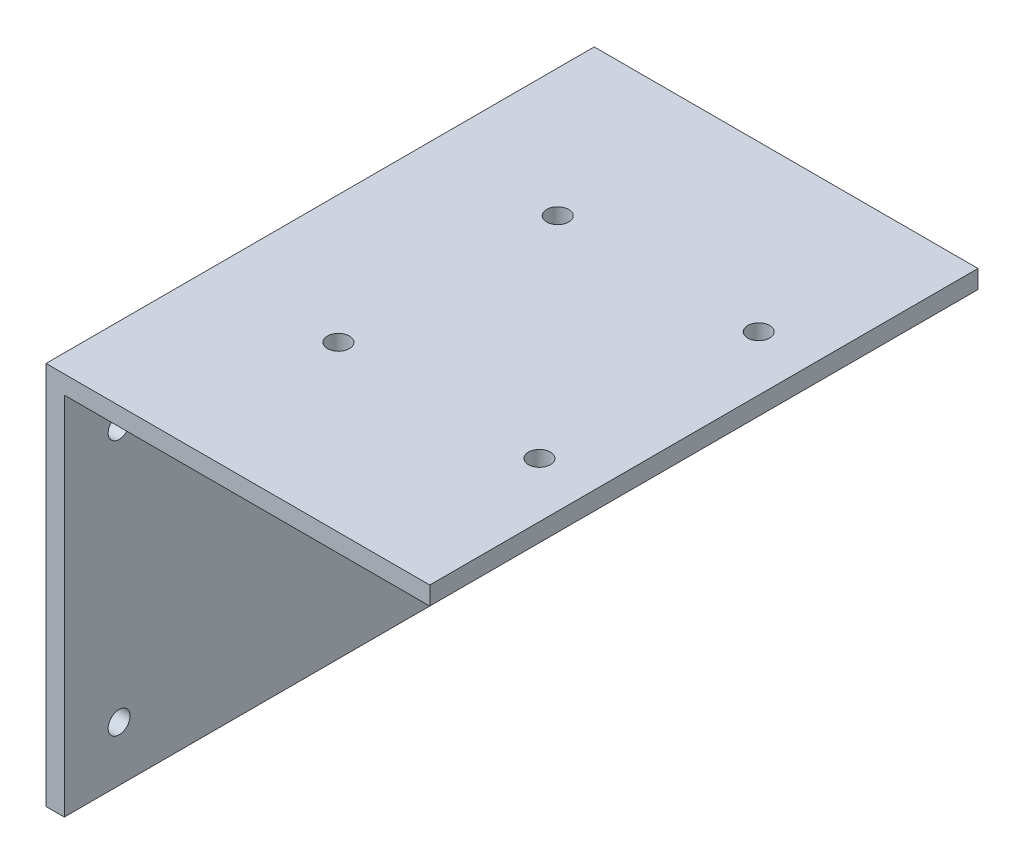
ISO-10303-21;
HEADER;
FILE_DESCRIPTION(('STEP AP214'),'2;1');
FILE_NAME('part.step','',(''),(''),'','','');
FILE_SCHEMA(('AUTOMOTIVE_DESIGN { 1 0 10303 214 1 1 1 1 }'));
ENDSEC;
DATA;
#1=APPLICATION_CONTEXT('core data for automotive mechanical design processes');
#2=APPLICATION_PROTOCOL_DEFINITION('international standard','automotive_design',2000,#1);
#3=PRODUCT_CONTEXT('',#1,'mechanical');
#4=PRODUCT('Part','Part','',(#3));
#5=PRODUCT_RELATED_PRODUCT_CATEGORY('part','',(#4));
#6=PRODUCT_DEFINITION_FORMATION('','',#4);
#7=PRODUCT_DEFINITION_CONTEXT('part definition',#1,'design');
#8=PRODUCT_DEFINITION('design','',#6,#7);
#9=PRODUCT_DEFINITION_SHAPE('','',#8);
#10=(LENGTH_UNIT() NAMED_UNIT(*) SI_UNIT(.MILLI.,.METRE.));
#11=(NAMED_UNIT(*) PLANE_ANGLE_UNIT() SI_UNIT($,.RADIAN.));
#12=(NAMED_UNIT(*) SI_UNIT($,.STERADIAN.) SOLID_ANGLE_UNIT());
#13=UNCERTAINTY_MEASURE_WITH_UNIT(LENGTH_MEASURE(1.E-05),#10,'distance_accuracy_value','');
#14=(GEOMETRIC_REPRESENTATION_CONTEXT(3) GLOBAL_UNCERTAINTY_ASSIGNED_CONTEXT((#13)) GLOBAL_UNIT_ASSIGNED_CONTEXT((#10,
#11,#12)) REPRESENTATION_CONTEXT('',''));
#15=CARTESIAN_POINT('',(0.,0.,0.));
#16=DIRECTION('',(0.,0.,1.));
#17=DIRECTION('',(1.,0.,0.));
#18=AXIS2_PLACEMENT_3D('',#15,#16,#17);
#19=CARTESIAN_POINT('',(5.,0.,150.));
#20=DIRECTION('',(0.,1.,0.));
#21=DIRECTION('',(0.,0.,1.));
#22=AXIS2_PLACEMENT_3D('',#19,#20,#21);
#23=PLANE('',#22);
#24=DIRECTION('',(1.,0.,0.));
#25=VECTOR('',#24,1.);
#26=CARTESIAN_POINT('',(5.,0.,0.));
#27=LINE('',#26,#25);
#28=CARTESIAN_POINT('',(0.,0.,0.));
#29=VERTEX_POINT('',#28);
#30=CARTESIAN_POINT('',(5.,0.,0.));
#31=VERTEX_POINT('',#30);
#32=EDGE_CURVE('E128',#29,#31,#27,.T.);
#33=ORIENTED_EDGE('',*,*,#32,.T.);
#34=DIRECTION('',(0.,0.,-1.));
#35=VECTOR('',#34,1.);
#36=CARTESIAN_POINT('',(5.,0.,150.));
#37=LINE('',#36,#35);
#38=CARTESIAN_POINT('',(5.,0.,150.));
#39=VERTEX_POINT('',#38);
#40=EDGE_CURVE('E13',#39,#31,#37,.T.);
#41=ORIENTED_EDGE('',*,*,#40,.F.);
#42=DIRECTION('',(1.,0.,0.));
#43=VECTOR('',#42,1.);
#44=CARTESIAN_POINT('',(5.,0.,150.));
#45=LINE('',#44,#43);
#46=CARTESIAN_POINT('',(0.,0.,150.));
#47=VERTEX_POINT('',#46);
#48=EDGE_CURVE('E139',#47,#39,#45,.T.);
#49=ORIENTED_EDGE('',*,*,#48,.F.);
#50=DIRECTION('',(0.,0.,-1.));
#51=VECTOR('',#50,1.);
#52=CARTESIAN_POINT('',(0.,0.,150.));
#53=LINE('',#52,#51);
#54=EDGE_CURVE('E124',#47,#29,#53,.T.);
#55=ORIENTED_EDGE('',*,*,#54,.T.);
#56=EDGE_LOOP('',(#33,#41,#49,#55));
#57=FACE_BOUND('',#56,.T.);
#58=ADVANCED_FACE('F44',(#57),#23,.F.);
#59=CARTESIAN_POINT('',(4.99999999999999,100.,150.));
#60=DIRECTION('',(-1.,0.,0.));
#61=DIRECTION('',(0.,-1.,0.));
#62=AXIS2_PLACEMENT_3D('',#59,#60,#61);
#63=PLANE('',#62);
#64=CARTESIAN_POINT('',(5.,15.,135.));
#65=DIRECTION('',(1.,0.,0.));
#66=DIRECTION('',(0.,-1.,0.));
#67=AXIS2_PLACEMENT_3D('',#64,#65,#66);
#68=CIRCLE('',#67,2.99999999999999);
#69=CARTESIAN_POINT('',(5.,12.,135.));
#70=VERTEX_POINT('',#69);
#71=EDGE_CURVE('E323',#70,#70,#68,.T.);
#72=ORIENTED_EDGE('',*,*,#71,.F.);
#73=EDGE_LOOP('',(#72));
#74=FACE_BOUND('',#73,.T.);
#75=CARTESIAN_POINT('',(5.,15.,15.));
#76=DIRECTION('',(1.,0.,0.));
#77=DIRECTION('',(0.,1.,0.));
#78=AXIS2_PLACEMENT_3D('',#75,#76,#77);
#79=CIRCLE('',#78,3.);
#80=CARTESIAN_POINT('',(5.,18.,15.));
#81=VERTEX_POINT('',#80);
#82=EDGE_CURVE('E322',#81,#81,#79,.T.);
#83=ORIENTED_EDGE('',*,*,#82,.F.);
#84=EDGE_LOOP('',(#83));
#85=FACE_BOUND('',#84,.T.);
#86=CARTESIAN_POINT('',(4.99999999999999,85.0000000000001,15.));
#87=DIRECTION('',(1.,0.,0.));
#88=DIRECTION('',(0.,-1.,0.));
#89=AXIS2_PLACEMENT_3D('',#86,#87,#88);
#90=CIRCLE('',#89,3.);
#91=CARTESIAN_POINT('',(4.99999999999999,82.0000000000001,15.));
#92=VERTEX_POINT('',#91);
#93=EDGE_CURVE('E330',#92,#92,#90,.T.);
#94=ORIENTED_EDGE('',*,*,#93,.F.);
#95=EDGE_LOOP('',(#94));
#96=FACE_BOUND('',#95,.T.);
#97=CARTESIAN_POINT('',(4.99999999999999,85.,135.));
#98=DIRECTION('',(1.,0.,0.));
#99=DIRECTION('',(0.,1.,0.));
#100=AXIS2_PLACEMENT_3D('',#97,#98,#99);
#101=CIRCLE('',#100,2.99999999999999);
#102=CARTESIAN_POINT('',(4.99999999999999,88.,135.));
#103=VERTEX_POINT('',#102);
#104=EDGE_CURVE('E309',#103,#103,#101,.T.);
#105=ORIENTED_EDGE('',*,*,#104,.F.);
#106=EDGE_LOOP('',(#105));
#107=FACE_BOUND('',#106,.T.);
#108=DIRECTION('',(0.,1.,0.));
#109=VECTOR('',#108,1.);
#110=CARTESIAN_POINT('',(4.99999999999999,100.,0.));
#111=LINE('',#110,#109);
#112=CARTESIAN_POINT('',(4.99999999999999,100.,0.));
#113=VERTEX_POINT('',#112);
#114=EDGE_CURVE('E131',#31,#113,#111,.T.);
#115=ORIENTED_EDGE('',*,*,#114,.T.);
#116=DIRECTION('',(0.,0.,-1.));
#117=VECTOR('',#116,1.);
#118=CARTESIAN_POINT('',(4.99999999999999,100.,150.));
#119=LINE('',#118,#117);
#120=CARTESIAN_POINT('',(4.99999999999999,100.,150.));
#121=VERTEX_POINT('',#120);
#122=EDGE_CURVE('E52',#121,#113,#119,.T.);
#123=ORIENTED_EDGE('',*,*,#122,.F.);
#124=DIRECTION('',(0.,1.,0.));
#125=VECTOR('',#124,1.);
#126=CARTESIAN_POINT('',(4.99999999999999,100.,150.));
#127=LINE('',#126,#125);
#128=EDGE_CURVE('E97',#39,#121,#127,.T.);
#129=ORIENTED_EDGE('',*,*,#128,.F.);
#130=ORIENTED_EDGE('',*,*,#40,.T.);
#131=EDGE_LOOP('',(#115,#123,#129,#130));
#132=FACE_BOUND('',#131,.T.);
#133=ADVANCED_FACE('F167',(#74,#85,#96,#107,#132),#63,.F.);
#134=CARTESIAN_POINT('',(105.,100.,150.));
#135=DIRECTION('',(0.,1.,0.));
#136=DIRECTION('',(-1.,0.,0.));
#137=AXIS2_PLACEMENT_3D('',#134,#135,#136);
#138=PLANE('',#137);
#139=CARTESIAN_POINT('',(35.,100.,45.));
#140=DIRECTION('',(0.,-1.,0.));
#141=DIRECTION('',(-1.,0.,0.));
#142=AXIS2_PLACEMENT_3D('',#139,#140,#141);
#143=CIRCLE('',#142,3.);
#144=CARTESIAN_POINT('',(32.,100.,45.));
#145=VERTEX_POINT('',#144);
#146=EDGE_CURVE('E347',#145,#145,#143,.T.);
#147=ORIENTED_EDGE('',*,*,#146,.F.);
#148=EDGE_LOOP('',(#147));
#149=FACE_BOUND('',#148,.T.);
#150=CARTESIAN_POINT('',(90.,100.,45.));
#151=DIRECTION('',(0.,-1.,0.));
#152=DIRECTION('',(1.,0.,0.));
#153=AXIS2_PLACEMENT_3D('',#150,#151,#152);
#154=CIRCLE('',#153,3.00000000000001);
#155=CARTESIAN_POINT('',(93.,100.,45.));
#156=VERTEX_POINT('',#155);
#157=EDGE_CURVE('E346',#156,#156,#154,.T.);
#158=ORIENTED_EDGE('',*,*,#157,.F.);
#159=EDGE_LOOP('',(#158));
#160=FACE_BOUND('',#159,.T.);
#161=CARTESIAN_POINT('',(90.,100.,105.));
#162=DIRECTION('',(0.,-1.,0.));
#163=DIRECTION('',(-1.,0.,0.));
#164=AXIS2_PLACEMENT_3D('',#161,#162,#163);
#165=CIRCLE('',#164,3.00000000000001);
#166=CARTESIAN_POINT('',(87.,100.,105.));
#167=VERTEX_POINT('',#166);
#168=EDGE_CURVE('E352',#167,#167,#165,.T.);
#169=ORIENTED_EDGE('',*,*,#168,.F.);
#170=EDGE_LOOP('',(#169));
#171=FACE_BOUND('',#170,.T.);
#172=CARTESIAN_POINT('',(35.,100.,105.));
#173=DIRECTION('',(0.,-1.,0.));
#174=DIRECTION('',(1.,0.,0.));
#175=AXIS2_PLACEMENT_3D('',#172,#173,#174);
#176=CIRCLE('',#175,2.99999999999999);
#177=CARTESIAN_POINT('',(38.,100.,105.));
#178=VERTEX_POINT('',#177);
#179=EDGE_CURVE('E339',#178,#178,#176,.T.);
#180=ORIENTED_EDGE('',*,*,#179,.F.);
#181=EDGE_LOOP('',(#180));
#182=FACE_BOUND('',#181,.T.);
#183=DIRECTION('',(1.,0.,0.));
#184=VECTOR('',#183,1.);
#185=CARTESIAN_POINT('',(105.,100.,0.));
#186=LINE('',#185,#184);
#187=CARTESIAN_POINT('',(105.,100.,0.));
#188=VERTEX_POINT('',#187);
#189=EDGE_CURVE('E134',#113,#188,#186,.T.);
#190=ORIENTED_EDGE('',*,*,#189,.T.);
#191=DIRECTION('',(0.,0.,-1.));
#192=VECTOR('',#191,1.);
#193=CARTESIAN_POINT('',(105.,100.,150.));
#194=LINE('',#193,#192);
#195=CARTESIAN_POINT('',(105.,100.,150.));
#196=VERTEX_POINT('',#195);
#197=EDGE_CURVE('E119',#196,#188,#194,.T.);
#198=ORIENTED_EDGE('',*,*,#197,.F.);
#199=DIRECTION('',(1.,0.,0.));
#200=VECTOR('',#199,1.);
#201=CARTESIAN_POINT('',(105.,100.,150.));
#202=LINE('',#201,#200);
#203=EDGE_CURVE('E110',#121,#196,#202,.T.);
#204=ORIENTED_EDGE('',*,*,#203,.F.);
#205=ORIENTED_EDGE('',*,*,#122,.T.);
#206=EDGE_LOOP('',(#190,#198,#204,#205));
#207=FACE_BOUND('',#206,.T.);
#208=ADVANCED_FACE('F145',(#149,#160,#171,#182,#207),#138,.F.);
#209=CARTESIAN_POINT('',(105.,105.,150.));
#210=DIRECTION('',(-1.,0.,0.));
#211=DIRECTION('',(0.,0.,1.));
#212=AXIS2_PLACEMENT_3D('',#209,#210,#211);
#213=PLANE('',#212);
#214=DIRECTION('',(0.,1.,0.));
#215=VECTOR('',#214,1.);
#216=CARTESIAN_POINT('',(105.,105.,0.));
#217=LINE('',#216,#215);
#218=CARTESIAN_POINT('',(105.,105.,0.));
#219=VERTEX_POINT('',#218);
#220=EDGE_CURVE('E118',#188,#219,#217,.T.);
#221=ORIENTED_EDGE('',*,*,#220,.T.);
#222=DIRECTION('',(0.,0.,-1.));
#223=VECTOR('',#222,1.);
#224=CARTESIAN_POINT('',(105.,105.,150.));
#225=LINE('',#224,#223);
#226=CARTESIAN_POINT('',(105.,105.,150.));
#227=VERTEX_POINT('',#226);
#228=EDGE_CURVE('E115',#227,#219,#225,.T.);
#229=ORIENTED_EDGE('',*,*,#228,.F.);
#230=DIRECTION('',(0.,1.,0.));
#231=VECTOR('',#230,1.);
#232=CARTESIAN_POINT('',(105.,105.,150.));
#233=LINE('',#232,#231);
#234=EDGE_CURVE('E104',#196,#227,#233,.T.);
#235=ORIENTED_EDGE('',*,*,#234,.F.);
#236=ORIENTED_EDGE('',*,*,#197,.T.);
#237=EDGE_LOOP('',(#221,#229,#235,#236));
#238=FACE_BOUND('',#237,.T.);
#239=ADVANCED_FACE('F116',(#238),#213,.F.);
#240=CARTESIAN_POINT('',(0.,105.,150.));
#241=DIRECTION('',(0.,-1.,0.));
#242=DIRECTION('',(1.,0.,0.));
#243=AXIS2_PLACEMENT_3D('',#240,#241,#242);
#244=PLANE('',#243);
#245=CARTESIAN_POINT('',(35.,105.,45.));
#246=DIRECTION('',(0.,-1.,0.));
#247=DIRECTION('',(1.,0.,0.));
#248=AXIS2_PLACEMENT_3D('',#245,#246,#247);
#249=CIRCLE('',#248,3.);
#250=CARTESIAN_POINT('',(38.,105.,45.));
#251=VERTEX_POINT('',#250);
#252=EDGE_CURVE('E343',#251,#251,#249,.F.);
#253=ORIENTED_EDGE('',*,*,#252,.F.);
#254=EDGE_LOOP('',(#253));
#255=FACE_BOUND('',#254,.T.);
#256=CARTESIAN_POINT('',(90.,105.,45.));
#257=DIRECTION('',(0.,-1.,0.));
#258=DIRECTION('',(1.,0.,0.));
#259=AXIS2_PLACEMENT_3D('',#256,#257,#258);
#260=CIRCLE('',#259,3.00000000000001);
#261=CARTESIAN_POINT('',(93.,105.,45.));
#262=VERTEX_POINT('',#261);
#263=EDGE_CURVE('E349',#262,#262,#260,.F.);
#264=ORIENTED_EDGE('',*,*,#263,.F.);
#265=EDGE_LOOP('',(#264));
#266=FACE_BOUND('',#265,.T.);
#267=CARTESIAN_POINT('',(90.,105.,105.));
#268=DIRECTION('',(0.,-1.,0.));
#269=DIRECTION('',(1.,0.,0.));
#270=AXIS2_PLACEMENT_3D('',#267,#268,#269);
#271=CIRCLE('',#270,3.00000000000001);
#272=CARTESIAN_POINT('',(93.,105.,105.));
#273=VERTEX_POINT('',#272);
#274=EDGE_CURVE('E342',#273,#273,#271,.F.);
#275=ORIENTED_EDGE('',*,*,#274,.F.);
#276=EDGE_LOOP('',(#275));
#277=FACE_BOUND('',#276,.T.);
#278=CARTESIAN_POINT('',(35.,105.,105.));
#279=DIRECTION('',(0.,-1.,0.));
#280=DIRECTION('',(1.,0.,0.));
#281=AXIS2_PLACEMENT_3D('',#278,#279,#280);
#282=CIRCLE('',#281,2.99999999999999);
#283=CARTESIAN_POINT('',(38.,105.,105.));
#284=VERTEX_POINT('',#283);
#285=EDGE_CURVE('E326',#284,#284,#282,.F.);
#286=ORIENTED_EDGE('',*,*,#285,.F.);
#287=EDGE_LOOP('',(#286));
#288=FACE_BOUND('',#287,.T.);
#289=DIRECTION('',(-1.,0.,0.));
#290=VECTOR('',#289,1.);
#291=CARTESIAN_POINT('',(0.,105.,0.));
#292=LINE('',#291,#290);
#293=CARTESIAN_POINT('',(0.,105.,0.));
#294=VERTEX_POINT('',#293);
#295=EDGE_CURVE('E83',#219,#294,#292,.T.);
#296=ORIENTED_EDGE('',*,*,#295,.T.);
#297=DIRECTION('',(0.,0.,-1.));
#298=VECTOR('',#297,1.);
#299=CARTESIAN_POINT('',(0.,105.,150.));
#300=LINE('',#299,#298);
#301=CARTESIAN_POINT('',(0.,105.,150.));
#302=VERTEX_POINT('',#301);
#303=EDGE_CURVE('E120',#302,#294,#300,.T.);
#304=ORIENTED_EDGE('',*,*,#303,.F.);
#305=DIRECTION('',(-1.,0.,0.));
#306=VECTOR('',#305,1.);
#307=CARTESIAN_POINT('',(0.,105.,150.));
#308=LINE('',#307,#306);
#309=EDGE_CURVE('E108',#227,#302,#308,.T.);
#310=ORIENTED_EDGE('',*,*,#309,.F.);
#311=ORIENTED_EDGE('',*,*,#228,.T.);
#312=EDGE_LOOP('',(#296,#304,#310,#311));
#313=FACE_BOUND('',#312,.T.);
#314=ADVANCED_FACE('F122',(#255,#266,#277,#288,#313),#244,.F.);
#315=CARTESIAN_POINT('',(0.,0.,150.));
#316=DIRECTION('',(1.,0.,0.));
#317=DIRECTION('',(0.,0.,-1.));
#318=AXIS2_PLACEMENT_3D('',#315,#316,#317);
#319=PLANE('',#318);
#320=CARTESIAN_POINT('',(0.,15.,135.));
#321=DIRECTION('',(1.,0.,0.));
#322=DIRECTION('',(0.,0.,-1.));
#323=AXIS2_PLACEMENT_3D('',#320,#321,#322);
#324=CIRCLE('',#323,2.99999999999999);
#325=CARTESIAN_POINT('',(0.,15.,132.));
#326=VERTEX_POINT('',#325);
#327=EDGE_CURVE('E319',#326,#326,#324,.F.);
#328=ORIENTED_EDGE('',*,*,#327,.F.);
#329=EDGE_LOOP('',(#328));
#330=FACE_BOUND('',#329,.T.);
#331=CARTESIAN_POINT('',(0.,15.,15.));
#332=DIRECTION('',(1.,0.,0.));
#333=DIRECTION('',(0.,0.,-1.));
#334=AXIS2_PLACEMENT_3D('',#331,#332,#333);
#335=CIRCLE('',#334,3.);
#336=CARTESIAN_POINT('',(0.,15.,12.));
#337=VERTEX_POINT('',#336);
#338=EDGE_CURVE('E327',#337,#337,#335,.F.);
#339=ORIENTED_EDGE('',*,*,#338,.F.);
#340=EDGE_LOOP('',(#339));
#341=FACE_BOUND('',#340,.T.);
#342=CARTESIAN_POINT('',(0.,85.0000000000001,15.));
#343=DIRECTION('',(1.,0.,0.));
#344=DIRECTION('',(0.,0.,-1.));
#345=AXIS2_PLACEMENT_3D('',#342,#343,#344);
#346=CIRCLE('',#345,3.);
#347=CARTESIAN_POINT('',(0.,85.0000000000001,12.));
#348=VERTEX_POINT('',#347);
#349=EDGE_CURVE('E314',#348,#348,#346,.F.);
#350=ORIENTED_EDGE('',*,*,#349,.F.);
#351=EDGE_LOOP('',(#350));
#352=FACE_BOUND('',#351,.T.);
#353=CARTESIAN_POINT('',(0.,85.,135.));
#354=DIRECTION('',(1.,0.,0.));
#355=DIRECTION('',(0.,0.,-1.));
#356=AXIS2_PLACEMENT_3D('',#353,#354,#355);
#357=CIRCLE('',#356,2.99999999999999);
#358=CARTESIAN_POINT('',(0.,85.,132.));
#359=VERTEX_POINT('',#358);
#360=EDGE_CURVE('E132',#359,#359,#357,.F.);
#361=ORIENTED_EDGE('',*,*,#360,.F.);
#362=EDGE_LOOP('',(#361));
#363=FACE_BOUND('',#362,.T.);
#364=DIRECTION('',(0.,-1.,0.));
#365=VECTOR('',#364,1.);
#366=CARTESIAN_POINT('',(0.,0.,0.));
#367=LINE('',#366,#365);
#368=EDGE_CURVE('E89',#294,#29,#367,.T.);
#369=ORIENTED_EDGE('',*,*,#368,.T.);
#370=ORIENTED_EDGE('',*,*,#54,.F.);
#371=DIRECTION('',(0.,-1.,0.));
#372=VECTOR('',#371,1.);
#373=CARTESIAN_POINT('',(0.,0.,150.));
#374=LINE('',#373,#372);
#375=EDGE_CURVE('E60',#302,#47,#374,.T.);
#376=ORIENTED_EDGE('',*,*,#375,.F.);
#377=ORIENTED_EDGE('',*,*,#303,.T.);
#378=EDGE_LOOP('',(#369,#370,#376,#377));
#379=FACE_BOUND('',#378,.T.);
#380=ADVANCED_FACE('F152',(#330,#341,#352,#363,#379),#319,.F.);
#381=CARTESIAN_POINT('',(0.,0.,150.));
#382=DIRECTION('',(0.,0.,-1.));
#383=DIRECTION('',(-1.,0.,0.));
#384=AXIS2_PLACEMENT_3D('',#381,#382,#383);
#385=PLANE('',#384);
#386=ORIENTED_EDGE('',*,*,#48,.T.);
#387=ORIENTED_EDGE('',*,*,#128,.T.);
#388=ORIENTED_EDGE('',*,*,#203,.T.);
#389=ORIENTED_EDGE('',*,*,#234,.T.);
#390=ORIENTED_EDGE('',*,*,#309,.T.);
#391=ORIENTED_EDGE('',*,*,#375,.T.);
#392=EDGE_LOOP('',(#386,#387,#388,#389,#390,#391));
#393=FACE_BOUND('',#392,.T.);
#394=ADVANCED_FACE('F106',(#393),#385,.F.);
#395=CARTESIAN_POINT('',(0.,0.,0.));
#396=DIRECTION('',(0.,0.,-1.));
#397=DIRECTION('',(-1.,0.,0.));
#398=AXIS2_PLACEMENT_3D('',#395,#396,#397);
#399=PLANE('',#398);
#400=ORIENTED_EDGE('',*,*,#32,.F.);
#401=ORIENTED_EDGE('',*,*,#368,.F.);
#402=ORIENTED_EDGE('',*,*,#295,.F.);
#403=ORIENTED_EDGE('',*,*,#220,.F.);
#404=ORIENTED_EDGE('',*,*,#189,.F.);
#405=ORIENTED_EDGE('',*,*,#114,.F.);
#406=EDGE_LOOP('',(#400,#401,#402,#403,#404,#405));
#407=FACE_BOUND('',#406,.T.);
#408=ADVANCED_FACE('F148',(#407),#399,.T.);
#409=CARTESIAN_POINT('',(-0.00100000000000794,85.,135.));
#410=DIRECTION('',(1.,0.,0.));
#411=DIRECTION('',(0.,1.,0.));
#412=AXIS2_PLACEMENT_3D('',#409,#410,#411);
#413=CYLINDRICAL_SURFACE('',#412,2.99999999999999);
#414=ORIENTED_EDGE('',*,*,#104,.T.);
#415=EDGE_LOOP('',(#414));
#416=FACE_BOUND('',#415,.T.);
#417=ORIENTED_EDGE('',*,*,#360,.T.);
#418=EDGE_LOOP('',(#417));
#419=FACE_BOUND('',#418,.T.);
#420=ADVANCED_FACE('F248',(#416,#419),#413,.F.);
#421=CARTESIAN_POINT('',(-0.00100000000000794,85.0000000000001,15.));
#422=DIRECTION('',(1.,0.,0.));
#423=DIRECTION('',(0.,1.,0.));
#424=AXIS2_PLACEMENT_3D('',#421,#422,#423);
#425=CYLINDRICAL_SURFACE('',#424,3.);
#426=ORIENTED_EDGE('',*,*,#93,.T.);
#427=EDGE_LOOP('',(#426));
#428=FACE_BOUND('',#427,.T.);
#429=ORIENTED_EDGE('',*,*,#349,.T.);
#430=EDGE_LOOP('',(#429));
#431=FACE_BOUND('',#430,.T.);
#432=ADVANCED_FACE('F244',(#428,#431),#425,.F.);
#433=CARTESIAN_POINT('',(-0.001000000000001,15.,15.));
#434=DIRECTION('',(1.,0.,0.));
#435=DIRECTION('',(0.,1.,0.));
#436=AXIS2_PLACEMENT_3D('',#433,#434,#435);
#437=CYLINDRICAL_SURFACE('',#436,3.);
#438=ORIENTED_EDGE('',*,*,#82,.T.);
#439=EDGE_LOOP('',(#438));
#440=FACE_BOUND('',#439,.T.);
#441=ORIENTED_EDGE('',*,*,#338,.T.);
#442=EDGE_LOOP('',(#441));
#443=FACE_BOUND('',#442,.T.);
#444=ADVANCED_FACE('F247',(#440,#443),#437,.F.);
#445=CARTESIAN_POINT('',(-0.00100000000000187,15.,135.));
#446=DIRECTION('',(1.,0.,0.));
#447=DIRECTION('',(0.,1.,0.));
#448=AXIS2_PLACEMENT_3D('',#445,#446,#447);
#449=CYLINDRICAL_SURFACE('',#448,2.99999999999999);
#450=ORIENTED_EDGE('',*,*,#71,.T.);
#451=EDGE_LOOP('',(#450));
#452=FACE_BOUND('',#451,.T.);
#453=ORIENTED_EDGE('',*,*,#327,.T.);
#454=EDGE_LOOP('',(#453));
#455=FACE_BOUND('',#454,.T.);
#456=ADVANCED_FACE('F205',(#452,#455),#449,.F.);
#457=CARTESIAN_POINT('',(35.,105.001,105.));
#458=DIRECTION('',(0.,-1.,0.));
#459=DIRECTION('',(1.,0.,0.));
#460=AXIS2_PLACEMENT_3D('',#457,#458,#459);
#461=CYLINDRICAL_SURFACE('',#460,2.99999999999999);
#462=ORIENTED_EDGE('',*,*,#179,.T.);
#463=EDGE_LOOP('',(#462));
#464=FACE_BOUND('',#463,.T.);
#465=ORIENTED_EDGE('',*,*,#285,.T.);
#466=EDGE_LOOP('',(#465));
#467=FACE_BOUND('',#466,.T.);
#468=ADVANCED_FACE('F199',(#464,#467),#461,.F.);
#469=CARTESIAN_POINT('',(90.,105.001,105.));
#470=DIRECTION('',(0.,-1.,0.));
#471=DIRECTION('',(1.,0.,0.));
#472=AXIS2_PLACEMENT_3D('',#469,#470,#471);
#473=CYLINDRICAL_SURFACE('',#472,3.00000000000001);
#474=ORIENTED_EDGE('',*,*,#168,.T.);
#475=EDGE_LOOP('',(#474));
#476=FACE_BOUND('',#475,.T.);
#477=ORIENTED_EDGE('',*,*,#274,.T.);
#478=EDGE_LOOP('',(#477));
#479=FACE_BOUND('',#478,.T.);
#480=ADVANCED_FACE('F204',(#476,#479),#473,.F.);
#481=CARTESIAN_POINT('',(90.,105.001,45.));
#482=DIRECTION('',(0.,-1.,0.));
#483=DIRECTION('',(1.,0.,0.));
#484=AXIS2_PLACEMENT_3D('',#481,#482,#483);
#485=CYLINDRICAL_SURFACE('',#484,3.00000000000001);
#486=ORIENTED_EDGE('',*,*,#157,.T.);
#487=EDGE_LOOP('',(#486));
#488=FACE_BOUND('',#487,.T.);
#489=ORIENTED_EDGE('',*,*,#263,.T.);
#490=EDGE_LOOP('',(#489));
#491=FACE_BOUND('',#490,.T.);
#492=ADVANCED_FACE('F217',(#488,#491),#485,.F.);
#493=CARTESIAN_POINT('',(35.,105.001,45.));
#494=DIRECTION('',(0.,-1.,0.));
#495=DIRECTION('',(1.,0.,0.));
#496=AXIS2_PLACEMENT_3D('',#493,#494,#495);
#497=CYLINDRICAL_SURFACE('',#496,3.);
#498=ORIENTED_EDGE('',*,*,#146,.T.);
#499=EDGE_LOOP('',(#498));
#500=FACE_BOUND('',#499,.T.);
#501=ORIENTED_EDGE('',*,*,#252,.T.);
#502=EDGE_LOOP('',(#501));
#503=FACE_BOUND('',#502,.T.);
#504=ADVANCED_FACE('F227',(#500,#503),#497,.F.);
#505=CLOSED_SHELL('',(#58,#133,#208,#239,#314,#380,#394,#408,#420,#432,#444,#456,#468,#480,#492,#504));
#506=MANIFOLD_SOLID_BREP('B2',#505);
#507=ADVANCED_BREP_SHAPE_REPRESENTATION('',(#18,#506),#14);
#508=SHAPE_DEFINITION_REPRESENTATION(#9,#507);
ENDSEC;
END-ISO-10303-21;
